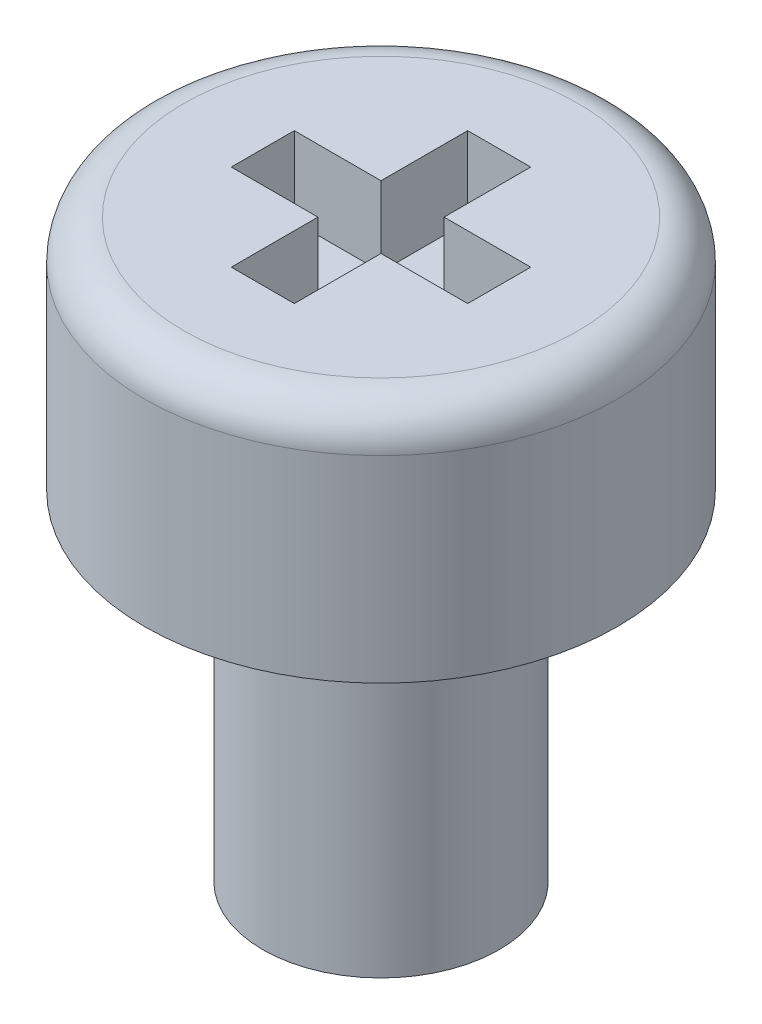
ISO-10303-21;
HEADER;
FILE_DESCRIPTION(('STEP AP214'),'2;1');
FILE_NAME('part.step','',(''),(''),'','','');
FILE_SCHEMA(('AUTOMOTIVE_DESIGN { 1 0 10303 214 1 1 1 1 }'));
ENDSEC;
DATA;
#1=APPLICATION_CONTEXT('core data for automotive mechanical design processes');
#2=APPLICATION_PROTOCOL_DEFINITION('international standard','automotive_design',2000,#1);
#3=PRODUCT_CONTEXT('',#1,'mechanical');
#4=PRODUCT('Part','Part','',(#3));
#5=PRODUCT_RELATED_PRODUCT_CATEGORY('part','',(#4));
#6=PRODUCT_DEFINITION_FORMATION('','',#4);
#7=PRODUCT_DEFINITION_CONTEXT('part definition',#1,'design');
#8=PRODUCT_DEFINITION('design','',#6,#7);
#9=PRODUCT_DEFINITION_SHAPE('','',#8);
#10=(LENGTH_UNIT() NAMED_UNIT(*) SI_UNIT(.MILLI.,.METRE.));
#11=(NAMED_UNIT(*) PLANE_ANGLE_UNIT() SI_UNIT($,.RADIAN.));
#12=(NAMED_UNIT(*) SI_UNIT($,.STERADIAN.) SOLID_ANGLE_UNIT());
#13=UNCERTAINTY_MEASURE_WITH_UNIT(LENGTH_MEASURE(1.E-05),#10,'distance_accuracy_value','');
#14=(GEOMETRIC_REPRESENTATION_CONTEXT(3) GLOBAL_UNCERTAINTY_ASSIGNED_CONTEXT((#13)) GLOBAL_UNIT_ASSIGNED_CONTEXT((#10,
#11,#12)) REPRESENTATION_CONTEXT('',''));
#15=CARTESIAN_POINT('',(0.,0.,0.));
#16=DIRECTION('',(0.,0.,1.));
#17=DIRECTION('',(1.,0.,0.));
#18=AXIS2_PLACEMENT_3D('',#15,#16,#17);
#19=CARTESIAN_POINT('',(0.,3.,0.));
#20=DIRECTION('',(0.,-1.,0.));
#21=DIRECTION('',(0.,0.,-1.));
#22=AXIS2_PLACEMENT_3D('',#19,#20,#21);
#23=CYLINDRICAL_SURFACE('',#22,3.);
#24=CARTESIAN_POINT('',(0.,2.5,0.));
#25=DIRECTION('',(0.,1.,0.));
#26=DIRECTION('',(0.,0.,1.));
#27=AXIS2_PLACEMENT_3D('',#24,#25,#26);
#28=CIRCLE('',#27,3.);
#29=CARTESIAN_POINT('',(0.,2.5,3.));
#30=VERTEX_POINT('',#29);
#31=EDGE_CURVE('E11',#30,#30,#28,.F.);
#32=ORIENTED_EDGE('',*,*,#31,.T.);
#33=EDGE_LOOP('',(#32));
#34=FACE_BOUND('',#33,.T.);
#35=CARTESIAN_POINT('',(0.,0.,0.));
#36=DIRECTION('',(0.,1.,0.));
#37=DIRECTION('',(0.,0.,1.));
#38=AXIS2_PLACEMENT_3D('',#35,#36,#37);
#39=CIRCLE('',#38,3.);
#40=CARTESIAN_POINT('',(0.,0.,3.));
#41=VERTEX_POINT('',#40);
#42=EDGE_CURVE('E247',#41,#41,#39,.T.);
#43=ORIENTED_EDGE('',*,*,#42,.T.);
#44=EDGE_LOOP('',(#43));
#45=FACE_BOUND('',#44,.T.);
#46=ADVANCED_FACE('F39',(#34,#45),#23,.T.);
#47=CARTESIAN_POINT('',(0.,3.,0.));
#48=DIRECTION('',(0.,1.,0.));
#49=DIRECTION('',(0.,0.,1.));
#50=AXIS2_PLACEMENT_3D('',#47,#48,#49);
#51=PLANE('',#50);
#52=DIRECTION('',(0.,0.,1.));
#53=VECTOR('',#52,1.);
#54=CARTESIAN_POINT('',(-0.4,3.,0.));
#55=LINE('',#54,#53);
#56=CARTESIAN_POINT('',(-0.4,3.,-1.5));
#57=VERTEX_POINT('',#56);
#58=CARTESIAN_POINT('',(-0.4,3.,-0.4));
#59=VERTEX_POINT('',#58);
#60=EDGE_CURVE('E55',#57,#59,#55,.T.);
#61=ORIENTED_EDGE('',*,*,#60,.F.);
#62=DIRECTION('',(-1.,0.,0.));
#63=VECTOR('',#62,1.);
#64=CARTESIAN_POINT('',(0.,3.,-1.5));
#65=LINE('',#64,#63);
#66=CARTESIAN_POINT('',(0.4,3.,-1.5));
#67=VERTEX_POINT('',#66);
#68=EDGE_CURVE('E210',#67,#57,#65,.T.);
#69=ORIENTED_EDGE('',*,*,#68,.F.);
#70=DIRECTION('',(0.,0.,1.));
#71=VECTOR('',#70,1.);
#72=CARTESIAN_POINT('',(0.4,3.,0.));
#73=LINE('',#72,#71);
#74=CARTESIAN_POINT('',(0.4,3.,-0.4));
#75=VERTEX_POINT('',#74);
#76=EDGE_CURVE('E207',#67,#75,#73,.T.);
#77=ORIENTED_EDGE('',*,*,#76,.T.);
#78=DIRECTION('',(1.,0.,0.));
#79=VECTOR('',#78,1.);
#80=CARTESIAN_POINT('',(0.,3.,-0.4));
#81=LINE('',#80,#79);
#82=CARTESIAN_POINT('',(1.5,3.,-0.4));
#83=VERTEX_POINT('',#82);
#84=EDGE_CURVE('E151',#75,#83,#81,.T.);
#85=ORIENTED_EDGE('',*,*,#84,.T.);
#86=DIRECTION('',(0.,0.,1.));
#87=VECTOR('',#86,1.);
#88=CARTESIAN_POINT('',(1.5,3.,0.));
#89=LINE('',#88,#87);
#90=CARTESIAN_POINT('',(1.5,3.,0.4));
#91=VERTEX_POINT('',#90);
#92=EDGE_CURVE('E201',#83,#91,#89,.T.);
#93=ORIENTED_EDGE('',*,*,#92,.T.);
#94=DIRECTION('',(1.,0.,0.));
#95=VECTOR('',#94,1.);
#96=CARTESIAN_POINT('',(0.,3.,0.4));
#97=LINE('',#96,#95);
#98=CARTESIAN_POINT('',(0.4,3.,0.4));
#99=VERTEX_POINT('',#98);
#100=EDGE_CURVE('E197',#99,#91,#97,.T.);
#101=ORIENTED_EDGE('',*,*,#100,.F.);
#102=DIRECTION('',(0.,0.,1.));
#103=VECTOR('',#102,1.);
#104=CARTESIAN_POINT('',(0.4,3.,0.));
#105=LINE('',#104,#103);
#106=CARTESIAN_POINT('',(0.4,3.,1.5));
#107=VERTEX_POINT('',#106);
#108=EDGE_CURVE('E193',#99,#107,#105,.T.);
#109=ORIENTED_EDGE('',*,*,#108,.T.);
#110=DIRECTION('',(-1.,0.,0.));
#111=VECTOR('',#110,1.);
#112=CARTESIAN_POINT('',(0.,3.,1.5));
#113=LINE('',#112,#111);
#114=CARTESIAN_POINT('',(-0.4,3.,1.5));
#115=VERTEX_POINT('',#114);
#116=EDGE_CURVE('E189',#107,#115,#113,.T.);
#117=ORIENTED_EDGE('',*,*,#116,.T.);
#118=DIRECTION('',(0.,0.,1.));
#119=VECTOR('',#118,1.);
#120=CARTESIAN_POINT('',(-0.4,3.,0.));
#121=LINE('',#120,#119);
#122=CARTESIAN_POINT('',(-0.4,3.,0.4));
#123=VERTEX_POINT('',#122);
#124=EDGE_CURVE('E185',#123,#115,#121,.T.);
#125=ORIENTED_EDGE('',*,*,#124,.F.);
#126=DIRECTION('',(1.,0.,0.));
#127=VECTOR('',#126,1.);
#128=CARTESIAN_POINT('',(0.,3.,0.4));
#129=LINE('',#128,#127);
#130=CARTESIAN_POINT('',(-1.5,3.,0.4));
#131=VERTEX_POINT('',#130);
#132=EDGE_CURVE('E181',#131,#123,#129,.T.);
#133=ORIENTED_EDGE('',*,*,#132,.F.);
#134=DIRECTION('',(0.,0.,1.));
#135=VECTOR('',#134,1.);
#136=CARTESIAN_POINT('',(-1.5,3.,0.));
#137=LINE('',#136,#135);
#138=CARTESIAN_POINT('',(-1.5,3.,-0.4));
#139=VERTEX_POINT('',#138);
#140=EDGE_CURVE('E177',#139,#131,#137,.T.);
#141=ORIENTED_EDGE('',*,*,#140,.F.);
#142=DIRECTION('',(1.,0.,0.));
#143=VECTOR('',#142,1.);
#144=CARTESIAN_POINT('',(0.,3.,-0.4));
#145=LINE('',#144,#143);
#146=EDGE_CURVE('E173',#139,#59,#145,.T.);
#147=ORIENTED_EDGE('',*,*,#146,.T.);
#148=EDGE_LOOP('',(#61,#69,#77,#85,#93,#101,#109,#117,#125,#133,#141,#147));
#149=FACE_BOUND('',#148,.T.);
#150=CARTESIAN_POINT('',(0.,3.,0.));
#151=DIRECTION('',(0.,1.,0.));
#152=DIRECTION('',(0.,0.,1.));
#153=AXIS2_PLACEMENT_3D('',#150,#151,#152);
#154=CIRCLE('',#153,2.5);
#155=CARTESIAN_POINT('',(0.,3.,2.5));
#156=VERTEX_POINT('',#155);
#157=EDGE_CURVE('E48',#156,#156,#154,.T.);
#158=ORIENTED_EDGE('',*,*,#157,.T.);
#159=EDGE_LOOP('',(#158));
#160=FACE_BOUND('',#159,.T.);
#161=ADVANCED_FACE('F258',(#149,#160),#51,.T.);
#162=CARTESIAN_POINT('',(0.,0.,0.));
#163=DIRECTION('',(0.,1.,0.));
#164=DIRECTION('',(0.,0.,1.));
#165=AXIS2_PLACEMENT_3D('',#162,#163,#164);
#166=PLANE('',#165);
#167=CARTESIAN_POINT('',(0.,0.,0.));
#168=DIRECTION('',(0.,-1.,0.));
#169=DIRECTION('',(0.,0.,-1.));
#170=AXIS2_PLACEMENT_3D('',#167,#168,#169);
#171=CIRCLE('',#170,1.5);
#172=CARTESIAN_POINT('',(0.,0.,1.5));
#173=VERTEX_POINT('',#172);
#174=EDGE_CURVE('E248',#173,#173,#171,.T.);
#175=ORIENTED_EDGE('',*,*,#174,.F.);
#176=EDGE_LOOP('',(#175));
#177=FACE_BOUND('',#176,.T.);
#178=ORIENTED_EDGE('',*,*,#42,.F.);
#179=EDGE_LOOP('',(#178));
#180=FACE_BOUND('',#179,.T.);
#181=ADVANCED_FACE('F279',(#177,#180),#166,.F.);
#182=CARTESIAN_POINT('',(0.,-4.3,0.));
#183=DIRECTION('',(0.,1.,0.));
#184=DIRECTION('',(0.,0.,1.));
#185=AXIS2_PLACEMENT_3D('',#182,#183,#184);
#186=CYLINDRICAL_SURFACE('',#185,1.5);
#187=CARTESIAN_POINT('',(0.,-4.3,0.));
#188=DIRECTION('',(0.,-1.,0.));
#189=DIRECTION('',(0.,0.,-1.));
#190=AXIS2_PLACEMENT_3D('',#187,#188,#189);
#191=CIRCLE('',#190,1.5);
#192=CARTESIAN_POINT('',(0.,-4.3,1.5));
#193=VERTEX_POINT('',#192);
#194=EDGE_CURVE('E216',#193,#193,#191,.T.);
#195=CARTESIAN_POINT('',(0.,-4.3,1.5));
#196=CARTESIAN_POINT('',(0.,-4.25520833333333,1.5));
#197=CARTESIAN_POINT('',(0.,-4.21041666666667,1.5));
#198=CARTESIAN_POINT('',(0.,-4.12083333333333,1.5));
#199=CARTESIAN_POINT('',(0.,-4.07604166666667,1.5));
#200=CARTESIAN_POINT('',(0.,-3.98645833333333,1.5));
#201=CARTESIAN_POINT('',(0.,-3.94166666666667,1.5));
#202=CARTESIAN_POINT('',(0.,-3.85208333333333,1.5));
#203=CARTESIAN_POINT('',(0.,-3.80729166666667,1.5));
#204=CARTESIAN_POINT('',(0.,-3.71770833333333,1.5));
#205=CARTESIAN_POINT('',(0.,-3.67291666666667,1.5));
#206=CARTESIAN_POINT('',(0.,-3.58333333333333,1.5));
#207=CARTESIAN_POINT('',(0.,-3.53854166666667,1.5));
#208=CARTESIAN_POINT('',(0.,-3.44895833333333,1.5));
#209=CARTESIAN_POINT('',(0.,-3.40416666666667,1.5));
#210=CARTESIAN_POINT('',(0.,-3.31458333333333,1.5));
#211=CARTESIAN_POINT('',(0.,-3.26979166666667,1.5));
#212=CARTESIAN_POINT('',(0.,-3.18020833333333,1.5));
#213=CARTESIAN_POINT('',(0.,-3.13541666666667,1.5));
#214=CARTESIAN_POINT('',(0.,-3.04583333333333,1.5));
#215=CARTESIAN_POINT('',(0.,-3.00104166666667,1.5));
#216=CARTESIAN_POINT('',(0.,-2.91145833333333,1.5));
#217=CARTESIAN_POINT('',(0.,-2.86666666666667,1.5));
#218=CARTESIAN_POINT('',(0.,-2.77708333333333,1.5));
#219=CARTESIAN_POINT('',(0.,-2.73229166666667,1.5));
#220=CARTESIAN_POINT('',(0.,-2.64270833333333,1.5));
#221=CARTESIAN_POINT('',(0.,-2.59791666666667,1.5));
#222=CARTESIAN_POINT('',(0.,-2.50833333333333,1.5));
#223=CARTESIAN_POINT('',(0.,-2.46354166666667,1.5));
#224=CARTESIAN_POINT('',(0.,-2.37395833333333,1.5));
#225=CARTESIAN_POINT('',(0.,-2.32916666666667,1.5));
#226=CARTESIAN_POINT('',(0.,-2.23958333333333,1.5));
#227=CARTESIAN_POINT('',(0.,-2.19479166666667,1.5));
#228=CARTESIAN_POINT('',(0.,-2.10520833333333,1.5));
#229=CARTESIAN_POINT('',(0.,-2.06041666666667,1.5));
#230=CARTESIAN_POINT('',(0.,-1.97083333333333,1.5));
#231=CARTESIAN_POINT('',(0.,-1.92604166666667,1.5));
#232=CARTESIAN_POINT('',(0.,-1.83645833333333,1.5));
#233=CARTESIAN_POINT('',(0.,-1.79166666666667,1.5));
#234=CARTESIAN_POINT('',(0.,-1.70208333333333,1.5));
#235=CARTESIAN_POINT('',(0.,-1.65729166666667,1.5));
#236=CARTESIAN_POINT('',(0.,-1.56770833333333,1.5));
#237=CARTESIAN_POINT('',(0.,-1.52291666666667,1.5));
#238=CARTESIAN_POINT('',(0.,-1.43333333333333,1.5));
#239=CARTESIAN_POINT('',(0.,-1.38854166666667,1.5));
#240=CARTESIAN_POINT('',(0.,-1.29895833333333,1.5));
#241=CARTESIAN_POINT('',(0.,-1.25416666666667,1.5));
#242=CARTESIAN_POINT('',(0.,-1.16458333333333,1.5));
#243=CARTESIAN_POINT('',(0.,-1.11979166666667,1.5));
#244=CARTESIAN_POINT('',(0.,-1.03020833333333,1.5));
#245=CARTESIAN_POINT('',(0.,-0.985416666666666,1.5));
#246=CARTESIAN_POINT('',(0.,-0.895833333333333,1.5));
#247=CARTESIAN_POINT('',(0.,-0.851041666666666,1.5));
#248=CARTESIAN_POINT('',(0.,-0.761458333333333,1.5));
#249=CARTESIAN_POINT('',(0.,-0.716666666666666,1.5));
#250=CARTESIAN_POINT('',(0.,-0.627083333333333,1.5));
#251=CARTESIAN_POINT('',(0.,-0.582291666666666,1.5));
#252=CARTESIAN_POINT('',(0.,-0.492708333333333,1.5));
#253=CARTESIAN_POINT('',(0.,-0.447916666666666,1.5));
#254=CARTESIAN_POINT('',(0.,-0.358333333333333,1.5));
#255=CARTESIAN_POINT('',(0.,-0.313541666666666,1.5));
#256=CARTESIAN_POINT('',(0.,-0.223958333333332,1.5));
#257=CARTESIAN_POINT('',(0.,-0.179166666666666,1.5));
#258=CARTESIAN_POINT('',(0.,-0.0895833333333324,1.5));
#259=CARTESIAN_POINT('',(0.,-0.0447916666666658,1.5));
#260=CARTESIAN_POINT('',(0.,0.,1.5));
#261=B_SPLINE_CURVE_WITH_KNOTS('',3,(#195,#196,#197,#198,#199,#200,#201,#202,#203,#204,#205,
#206,#207,#208,#209,#210,#211,#212,#213,#214,#215,#216,#217,#218,#219,#220,#221,#222,#223,#224,
#225,#226,#227,#228,#229,#230,#231,#232,#233,#234,#235,#236,#237,#238,#239,#240,#241,#242,#243,
#244,#245,#246,#247,#248,#249,#250,#251,#252,#253,#254,#255,#256,#257,#258,#259,#260),
.UNSPECIFIED.,.F.,.F.,(4,2,2,2,2,2,2,2,2,2,2,2,2,2,2,2,2,2,2,2,2,2,2,2,2,2,2,2,2,2,2,2,4),(0.,
0.134375,0.26875,0.403124999999999,0.5375,0.671875,0.80625,0.940625,1.075,1.209375,1.34375,
1.478125,1.6125,1.746875,1.88125,2.015625,2.15,2.284375,2.41875,2.553125,2.6875,2.821875,
2.95625,3.090625,3.225,3.359375,3.49375,3.628125,3.7625,3.896875,4.03125,4.165625,4.3),.UNSPECIFIED.);
#262=EDGE_CURVE('BSEAM270',#193,#173,#261,.T.);
#263=ORIENTED_EDGE('',*,*,#194,.F.);
#264=ORIENTED_EDGE('',*,*,#174,.T.);
#265=ORIENTED_EDGE('',*,*,#262,.T.);
#266=ORIENTED_EDGE('',*,*,#262,.F.);
#267=EDGE_LOOP('',(#263,#265,#264,#266));
#268=FACE_BOUND('',#267,.T.);
#269=ADVANCED_FACE('F270',(#268),#186,.T.);
#270=CARTESIAN_POINT('',(0.,-4.3,0.));
#271=DIRECTION('',(0.,-1.,0.));
#272=DIRECTION('',(0.,0.,-1.));
#273=AXIS2_PLACEMENT_3D('',#270,#271,#272);
#274=PLANE('',#273);
#275=ORIENTED_EDGE('',*,*,#194,.T.);
#276=EDGE_LOOP('',(#275));
#277=FACE_BOUND('',#276,.T.);
#278=ADVANCED_FACE('F262',(#277),#274,.T.);
#279=CARTESIAN_POINT('',(0.,2.5,0.));
#280=DIRECTION('',(0.,1.,0.));
#281=DIRECTION('',(0.,0.,1.));
#282=AXIS2_PLACEMENT_3D('',#279,#280,#281);
#283=TOROIDAL_SURFACE('',#282,2.5,0.5);
#284=ORIENTED_EDGE('',*,*,#31,.F.);
#285=EDGE_LOOP('',(#284));
#286=FACE_BOUND('',#285,.T.);
#287=ORIENTED_EDGE('',*,*,#157,.F.);
#288=EDGE_LOOP('',(#287));
#289=FACE_BOUND('',#288,.T.);
#290=ADVANCED_FACE('F41',(#286,#289),#283,.T.);
#291=CARTESIAN_POINT('',(-0.4,2.,0.));
#292=DIRECTION('',(-1.,0.,0.));
#293=DIRECTION('',(0.,0.,1.));
#294=AXIS2_PLACEMENT_3D('',#291,#292,#293);
#295=PLANE('',#294);
#296=ORIENTED_EDGE('',*,*,#60,.T.);
#297=DIRECTION('',(0.,1.,0.));
#298=VECTOR('',#297,1.);
#299=CARTESIAN_POINT('',(-0.4,2.,-0.4));
#300=LINE('',#299,#298);
#301=CARTESIAN_POINT('',(-0.4,2.,-0.4));
#302=VERTEX_POINT('',#301);
#303=EDGE_CURVE('E170',#302,#59,#300,.T.);
#304=ORIENTED_EDGE('',*,*,#303,.F.);
#305=DIRECTION('',(0.,0.,1.));
#306=VECTOR('',#305,1.);
#307=CARTESIAN_POINT('',(-0.4,2.,0.));
#308=LINE('',#307,#306);
#309=CARTESIAN_POINT('',(-0.4,2.,-1.5));
#310=VERTEX_POINT('',#309);
#311=EDGE_CURVE('E213',#310,#302,#308,.T.);
#312=ORIENTED_EDGE('',*,*,#311,.F.);
#313=DIRECTION('',(0.,1.,0.));
#314=VECTOR('',#313,1.);
#315=CARTESIAN_POINT('',(-0.4,2.,-1.5));
#316=LINE('',#315,#314);
#317=EDGE_CURVE('E63',#310,#57,#316,.T.);
#318=ORIENTED_EDGE('',*,*,#317,.T.);
#319=EDGE_LOOP('',(#296,#304,#312,#318));
#320=FACE_BOUND('',#319,.T.);
#321=ADVANCED_FACE('F261',(#320),#295,.F.);
#322=CARTESIAN_POINT('',(0.,2.,-1.5));
#323=DIRECTION('',(0.,0.,-1.));
#324=DIRECTION('',(-1.,0.,0.));
#325=AXIS2_PLACEMENT_3D('',#322,#323,#324);
#326=PLANE('',#325);
#327=ORIENTED_EDGE('',*,*,#68,.T.);
#328=ORIENTED_EDGE('',*,*,#317,.F.);
#329=DIRECTION('',(-1.,0.,0.));
#330=VECTOR('',#329,1.);
#331=CARTESIAN_POINT('',(0.,2.,-1.5));
#332=LINE('',#331,#330);
#333=CARTESIAN_POINT('',(0.4,2.,-1.5));
#334=VERTEX_POINT('',#333);
#335=EDGE_CURVE('E144',#334,#310,#332,.T.);
#336=ORIENTED_EDGE('',*,*,#335,.F.);
#337=DIRECTION('',(0.,1.,0.));
#338=VECTOR('',#337,1.);
#339=CARTESIAN_POINT('',(0.4,2.,-1.5));
#340=LINE('',#339,#338);
#341=EDGE_CURVE('E139',#334,#67,#340,.T.);
#342=ORIENTED_EDGE('',*,*,#341,.T.);
#343=EDGE_LOOP('',(#327,#328,#336,#342));
#344=FACE_BOUND('',#343,.T.);
#345=ADVANCED_FACE('F268',(#344),#326,.F.);
#346=CARTESIAN_POINT('',(0.4,2.,0.));
#347=DIRECTION('',(-1.,0.,0.));
#348=DIRECTION('',(0.,0.,1.));
#349=AXIS2_PLACEMENT_3D('',#346,#347,#348);
#350=PLANE('',#349);
#351=ORIENTED_EDGE('',*,*,#76,.F.);
#352=ORIENTED_EDGE('',*,*,#341,.F.);
#353=DIRECTION('',(0.,0.,1.));
#354=VECTOR('',#353,1.);
#355=CARTESIAN_POINT('',(0.4,2.,0.));
#356=LINE('',#355,#354);
#357=CARTESIAN_POINT('',(0.4,2.,-0.4));
#358=VERTEX_POINT('',#357);
#359=EDGE_CURVE('E133',#334,#358,#356,.T.);
#360=ORIENTED_EDGE('',*,*,#359,.T.);
#361=DIRECTION('',(0.,1.,0.));
#362=VECTOR('',#361,1.);
#363=CARTESIAN_POINT('',(0.4,2.,-0.4));
#364=LINE('',#363,#362);
#365=EDGE_CURVE('E137',#358,#75,#364,.T.);
#366=ORIENTED_EDGE('',*,*,#365,.T.);
#367=EDGE_LOOP('',(#351,#352,#360,#366));
#368=FACE_BOUND('',#367,.T.);
#369=ADVANCED_FACE('F136',(#368),#350,.T.);
#370=CARTESIAN_POINT('',(0.,2.,-0.4));
#371=DIRECTION('',(0.,0.,1.));
#372=DIRECTION('',(1.,0.,0.));
#373=AXIS2_PLACEMENT_3D('',#370,#371,#372);
#374=PLANE('',#373);
#375=ORIENTED_EDGE('',*,*,#84,.F.);
#376=ORIENTED_EDGE('',*,*,#365,.F.);
#377=DIRECTION('',(1.,0.,0.));
#378=VECTOR('',#377,1.);
#379=CARTESIAN_POINT('',(0.,2.,-0.4));
#380=LINE('',#379,#378);
#381=CARTESIAN_POINT('',(1.5,2.,-0.4));
#382=VERTEX_POINT('',#381);
#383=EDGE_CURVE('E145',#358,#382,#380,.T.);
#384=ORIENTED_EDGE('',*,*,#383,.T.);
#385=DIRECTION('',(0.,1.,0.));
#386=VECTOR('',#385,1.);
#387=CARTESIAN_POINT('',(1.5,2.,-0.4));
#388=LINE('',#387,#386);
#389=EDGE_CURVE('E154',#382,#83,#388,.T.);
#390=ORIENTED_EDGE('',*,*,#389,.T.);
#391=EDGE_LOOP('',(#375,#376,#384,#390));
#392=FACE_BOUND('',#391,.T.);
#393=ADVANCED_FACE('F148',(#392),#374,.T.);
#394=CARTESIAN_POINT('',(1.5,2.,0.));
#395=DIRECTION('',(-1.,0.,0.));
#396=DIRECTION('',(0.,0.,1.));
#397=AXIS2_PLACEMENT_3D('',#394,#395,#396);
#398=PLANE('',#397);
#399=ORIENTED_EDGE('',*,*,#92,.F.);
#400=ORIENTED_EDGE('',*,*,#389,.F.);
#401=DIRECTION('',(0.,0.,1.));
#402=VECTOR('',#401,1.);
#403=CARTESIAN_POINT('',(1.5,2.,0.));
#404=LINE('',#403,#402);
#405=CARTESIAN_POINT('',(1.5,2.,0.4));
#406=VERTEX_POINT('',#405);
#407=EDGE_CURVE('E160',#382,#406,#404,.T.);
#408=ORIENTED_EDGE('',*,*,#407,.T.);
#409=DIRECTION('',(0.,1.,0.));
#410=VECTOR('',#409,1.);
#411=CARTESIAN_POINT('',(1.5,2.,0.4));
#412=LINE('',#411,#410);
#413=EDGE_CURVE('E221',#406,#91,#412,.T.);
#414=ORIENTED_EDGE('',*,*,#413,.T.);
#415=EDGE_LOOP('',(#399,#400,#408,#414));
#416=FACE_BOUND('',#415,.T.);
#417=ADVANCED_FACE('F316',(#416),#398,.T.);
#418=CARTESIAN_POINT('',(0.,2.,0.4));
#419=DIRECTION('',(0.,0.,1.));
#420=DIRECTION('',(1.,0.,0.));
#421=AXIS2_PLACEMENT_3D('',#418,#419,#420);
#422=PLANE('',#421);
#423=ORIENTED_EDGE('',*,*,#100,.T.);
#424=ORIENTED_EDGE('',*,*,#413,.F.);
#425=DIRECTION('',(1.,0.,0.));
#426=VECTOR('',#425,1.);
#427=CARTESIAN_POINT('',(0.,2.,0.4));
#428=LINE('',#427,#426);
#429=CARTESIAN_POINT('',(0.4,2.,0.4));
#430=VERTEX_POINT('',#429);
#431=EDGE_CURVE('E164',#430,#406,#428,.T.);
#432=ORIENTED_EDGE('',*,*,#431,.F.);
#433=DIRECTION('',(0.,1.,0.));
#434=VECTOR('',#433,1.);
#435=CARTESIAN_POINT('',(0.4,2.,0.4));
#436=LINE('',#435,#434);
#437=EDGE_CURVE('E224',#430,#99,#436,.T.);
#438=ORIENTED_EDGE('',*,*,#437,.T.);
#439=EDGE_LOOP('',(#423,#424,#432,#438));
#440=FACE_BOUND('',#439,.T.);
#441=ADVANCED_FACE('F312',(#440),#422,.F.);
#442=CARTESIAN_POINT('',(0.4,2.,0.));
#443=DIRECTION('',(-1.,0.,0.));
#444=DIRECTION('',(0.,0.,1.));
#445=AXIS2_PLACEMENT_3D('',#442,#443,#444);
#446=PLANE('',#445);
#447=ORIENTED_EDGE('',*,*,#108,.F.);
#448=ORIENTED_EDGE('',*,*,#437,.F.);
#449=DIRECTION('',(0.,0.,1.));
#450=VECTOR('',#449,1.);
#451=CARTESIAN_POINT('',(0.4,2.,0.));
#452=LINE('',#451,#450);
#453=CARTESIAN_POINT('',(0.4,2.,1.5));
#454=VERTEX_POINT('',#453);
#455=EDGE_CURVE('E472',#430,#454,#452,.T.);
#456=ORIENTED_EDGE('',*,*,#455,.T.);
#457=DIRECTION('',(0.,1.,0.));
#458=VECTOR('',#457,1.);
#459=CARTESIAN_POINT('',(0.4,2.,1.5));
#460=LINE('',#459,#458);
#461=EDGE_CURVE('E227',#454,#107,#460,.T.);
#462=ORIENTED_EDGE('',*,*,#461,.T.);
#463=EDGE_LOOP('',(#447,#448,#456,#462));
#464=FACE_BOUND('',#463,.T.);
#465=ADVANCED_FACE('F308',(#464),#446,.T.);
#466=CARTESIAN_POINT('',(0.,2.,1.5));
#467=DIRECTION('',(0.,0.,-1.));
#468=DIRECTION('',(-1.,0.,0.));
#469=AXIS2_PLACEMENT_3D('',#466,#467,#468);
#470=PLANE('',#469);
#471=ORIENTED_EDGE('',*,*,#116,.F.);
#472=ORIENTED_EDGE('',*,*,#461,.F.);
#473=DIRECTION('',(-1.,0.,0.));
#474=VECTOR('',#473,1.);
#475=CARTESIAN_POINT('',(0.,2.,1.5));
#476=LINE('',#475,#474);
#477=CARTESIAN_POINT('',(-0.4,2.,1.5));
#478=VERTEX_POINT('',#477);
#479=EDGE_CURVE('E469',#454,#478,#476,.T.);
#480=ORIENTED_EDGE('',*,*,#479,.T.);
#481=DIRECTION('',(0.,1.,0.));
#482=VECTOR('',#481,1.);
#483=CARTESIAN_POINT('',(-0.4,2.,1.5));
#484=LINE('',#483,#482);
#485=EDGE_CURVE('E230',#478,#115,#484,.T.);
#486=ORIENTED_EDGE('',*,*,#485,.T.);
#487=EDGE_LOOP('',(#471,#472,#480,#486));
#488=FACE_BOUND('',#487,.T.);
#489=ADVANCED_FACE('F304',(#488),#470,.T.);
#490=CARTESIAN_POINT('',(-0.4,2.,0.));
#491=DIRECTION('',(-1.,0.,0.));
#492=DIRECTION('',(0.,0.,1.));
#493=AXIS2_PLACEMENT_3D('',#490,#491,#492);
#494=PLANE('',#493);
#495=ORIENTED_EDGE('',*,*,#124,.T.);
#496=ORIENTED_EDGE('',*,*,#485,.F.);
#497=DIRECTION('',(0.,0.,1.));
#498=VECTOR('',#497,1.);
#499=CARTESIAN_POINT('',(-0.4,2.,0.));
#500=LINE('',#499,#498);
#501=CARTESIAN_POINT('',(-0.4,2.,0.4));
#502=VERTEX_POINT('',#501);
#503=EDGE_CURVE('E465',#502,#478,#500,.T.);
#504=ORIENTED_EDGE('',*,*,#503,.F.);
#505=DIRECTION('',(0.,1.,0.));
#506=VECTOR('',#505,1.);
#507=CARTESIAN_POINT('',(-0.4,2.,0.4));
#508=LINE('',#507,#506);
#509=EDGE_CURVE('E233',#502,#123,#508,.T.);
#510=ORIENTED_EDGE('',*,*,#509,.T.);
#511=EDGE_LOOP('',(#495,#496,#504,#510));
#512=FACE_BOUND('',#511,.T.);
#513=ADVANCED_FACE('F300',(#512),#494,.F.);
#514=CARTESIAN_POINT('',(0.,2.,0.4));
#515=DIRECTION('',(0.,0.,1.));
#516=DIRECTION('',(1.,0.,0.));
#517=AXIS2_PLACEMENT_3D('',#514,#515,#516);
#518=PLANE('',#517);
#519=ORIENTED_EDGE('',*,*,#132,.T.);
#520=ORIENTED_EDGE('',*,*,#509,.F.);
#521=DIRECTION('',(1.,0.,0.));
#522=VECTOR('',#521,1.);
#523=CARTESIAN_POINT('',(0.,2.,0.4));
#524=LINE('',#523,#522);
#525=CARTESIAN_POINT('',(-1.5,2.,0.4));
#526=VERTEX_POINT('',#525);
#527=EDGE_CURVE('E461',#526,#502,#524,.T.);
#528=ORIENTED_EDGE('',*,*,#527,.F.);
#529=DIRECTION('',(0.,1.,0.));
#530=VECTOR('',#529,1.);
#531=CARTESIAN_POINT('',(-1.5,2.,0.4));
#532=LINE('',#531,#530);
#533=EDGE_CURVE('E236',#526,#131,#532,.T.);
#534=ORIENTED_EDGE('',*,*,#533,.T.);
#535=EDGE_LOOP('',(#519,#520,#528,#534));
#536=FACE_BOUND('',#535,.T.);
#537=ADVANCED_FACE('F296',(#536),#518,.F.);
#538=CARTESIAN_POINT('',(-1.5,2.,0.));
#539=DIRECTION('',(-1.,0.,0.));
#540=DIRECTION('',(0.,0.,1.));
#541=AXIS2_PLACEMENT_3D('',#538,#539,#540);
#542=PLANE('',#541);
#543=ORIENTED_EDGE('',*,*,#140,.T.);
#544=ORIENTED_EDGE('',*,*,#533,.F.);
#545=DIRECTION('',(0.,0.,1.));
#546=VECTOR('',#545,1.);
#547=CARTESIAN_POINT('',(-1.5,2.,0.));
#548=LINE('',#547,#546);
#549=CARTESIAN_POINT('',(-1.5,2.,-0.4));
#550=VERTEX_POINT('',#549);
#551=EDGE_CURVE('E456',#550,#526,#548,.T.);
#552=ORIENTED_EDGE('',*,*,#551,.F.);
#553=DIRECTION('',(0.,1.,0.));
#554=VECTOR('',#553,1.);
#555=CARTESIAN_POINT('',(-1.5,2.,-0.4));
#556=LINE('',#555,#554);
#557=EDGE_CURVE('E239',#550,#139,#556,.T.);
#558=ORIENTED_EDGE('',*,*,#557,.T.);
#559=EDGE_LOOP('',(#543,#544,#552,#558));
#560=FACE_BOUND('',#559,.T.);
#561=ADVANCED_FACE('F293',(#560),#542,.F.);
#562=CARTESIAN_POINT('',(0.,2.,-0.4));
#563=DIRECTION('',(0.,0.,1.));
#564=DIRECTION('',(1.,0.,0.));
#565=AXIS2_PLACEMENT_3D('',#562,#563,#564);
#566=PLANE('',#565);
#567=ORIENTED_EDGE('',*,*,#146,.F.);
#568=ORIENTED_EDGE('',*,*,#557,.F.);
#569=DIRECTION('',(1.,0.,0.));
#570=VECTOR('',#569,1.);
#571=CARTESIAN_POINT('',(0.,2.,-0.4));
#572=LINE('',#571,#570);
#573=EDGE_CURVE('E107',#550,#302,#572,.T.);
#574=ORIENTED_EDGE('',*,*,#573,.T.);
#575=ORIENTED_EDGE('',*,*,#303,.T.);
#576=EDGE_LOOP('',(#567,#568,#574,#575));
#577=FACE_BOUND('',#576,.T.);
#578=ADVANCED_FACE('F290',(#577),#566,.T.);
#579=CARTESIAN_POINT('',(0.,2.,0.));
#580=DIRECTION('',(0.,1.,0.));
#581=DIRECTION('',(0.,0.,1.));
#582=AXIS2_PLACEMENT_3D('',#579,#580,#581);
#583=PLANE('',#582);
#584=ORIENTED_EDGE('',*,*,#311,.T.);
#585=ORIENTED_EDGE('',*,*,#573,.F.);
#586=ORIENTED_EDGE('',*,*,#551,.T.);
#587=ORIENTED_EDGE('',*,*,#527,.T.);
#588=ORIENTED_EDGE('',*,*,#503,.T.);
#589=ORIENTED_EDGE('',*,*,#479,.F.);
#590=ORIENTED_EDGE('',*,*,#455,.F.);
#591=ORIENTED_EDGE('',*,*,#431,.T.);
#592=ORIENTED_EDGE('',*,*,#407,.F.);
#593=ORIENTED_EDGE('',*,*,#383,.F.);
#594=ORIENTED_EDGE('',*,*,#359,.F.);
#595=ORIENTED_EDGE('',*,*,#335,.T.);
#596=EDGE_LOOP('',(#584,#585,#586,#587,#588,#589,#590,#591,#592,#593,#594,#595));
#597=FACE_BOUND('',#596,.T.);
#598=ADVANCED_FACE('F158',(#597),#583,.T.);
#599=CLOSED_SHELL('',(#46,#161,#181,#269,#278,#290,#321,#345,#369,#393,#417,#441,#465,#489,#513,
#537,#561,#578,#598));
#600=MANIFOLD_SOLID_BREP('B2',#599);
#601=ADVANCED_BREP_SHAPE_REPRESENTATION('',(#18,#600),#14);
#602=SHAPE_DEFINITION_REPRESENTATION(#9,#601);
ENDSEC;
END-ISO-10303-21;
